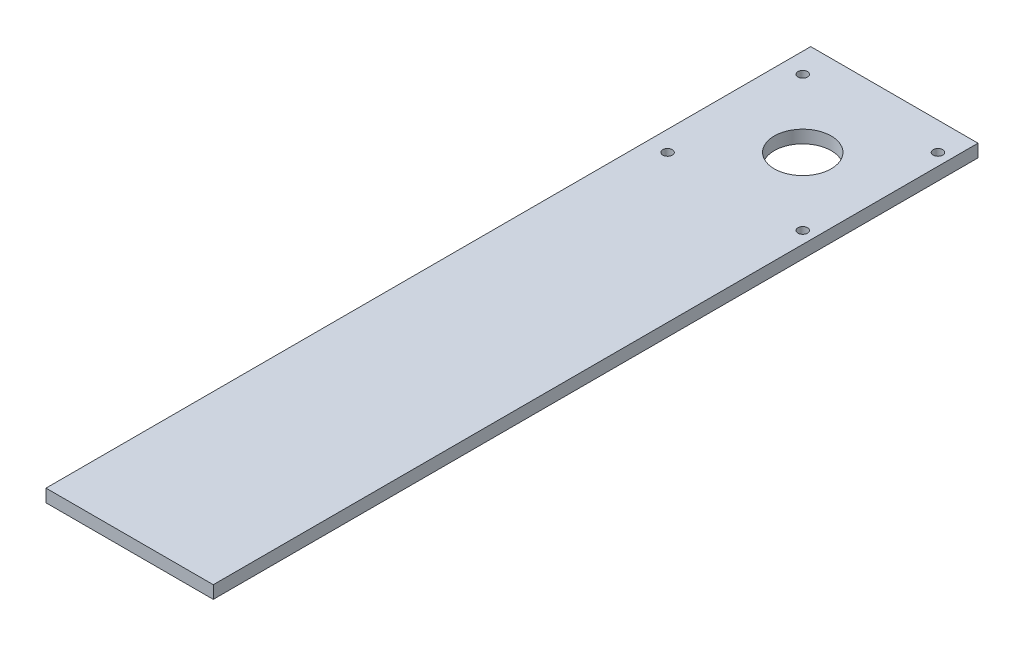
ISO-10303-21;
HEADER;
FILE_DESCRIPTION(('STEP AP214'),'2;1');
FILE_NAME('part.step','',(''),(''),'','','');
FILE_SCHEMA(('AUTOMOTIVE_DESIGN { 1 0 10303 214 1 1 1 1 }'));
ENDSEC;
DATA;
#1=APPLICATION_CONTEXT('core data for automotive mechanical design processes');
#2=APPLICATION_PROTOCOL_DEFINITION('international standard','automotive_design',2000,#1);
#3=PRODUCT_CONTEXT('',#1,'mechanical');
#4=PRODUCT('Part','Part','',(#3));
#5=PRODUCT_RELATED_PRODUCT_CATEGORY('part','',(#4));
#6=PRODUCT_DEFINITION_FORMATION('','',#4);
#7=PRODUCT_DEFINITION_CONTEXT('part definition',#1,'design');
#8=PRODUCT_DEFINITION('design','',#6,#7);
#9=PRODUCT_DEFINITION_SHAPE('','',#8);
#10=(LENGTH_UNIT() NAMED_UNIT(*) SI_UNIT(.MILLI.,.METRE.));
#11=(NAMED_UNIT(*) PLANE_ANGLE_UNIT() SI_UNIT($,.RADIAN.));
#12=(NAMED_UNIT(*) SI_UNIT($,.STERADIAN.) SOLID_ANGLE_UNIT());
#13=UNCERTAINTY_MEASURE_WITH_UNIT(LENGTH_MEASURE(1.E-05),#10,'distance_accuracy_value','');
#14=(GEOMETRIC_REPRESENTATION_CONTEXT(3) GLOBAL_UNCERTAINTY_ASSIGNED_CONTEXT((#13)) GLOBAL_UNIT_ASSIGNED_CONTEXT((#10,
#11,#12)) REPRESENTATION_CONTEXT('',''));
#15=CARTESIAN_POINT('',(0.,0.,0.));
#16=DIRECTION('',(0.,0.,1.));
#17=DIRECTION('',(1.,0.,0.));
#18=AXIS2_PLACEMENT_3D('',#15,#16,#17);
#19=CARTESIAN_POINT('',(0.,8.,0.));
#20=DIRECTION('',(0.,-1.,0.));
#21=DIRECTION('',(0.,0.,-1.));
#22=AXIS2_PLACEMENT_3D('',#19,#20,#21);
#23=PLANE('',#22);
#24=DIRECTION('',(0.,0.,-1.));
#25=VECTOR('',#24,1.);
#26=CARTESIAN_POINT('',(50.,8.,240.));
#27=LINE('',#26,#25);
#28=CARTESIAN_POINT('',(50.,8.,240.));
#29=VERTEX_POINT('',#28);
#30=CARTESIAN_POINT('',(50.,8.,-240.));
#31=VERTEX_POINT('',#30);
#32=EDGE_CURVE('E89',#29,#31,#27,.T.);
#33=ORIENTED_EDGE('',*,*,#32,.T.);
#34=DIRECTION('',(-1.,0.,0.));
#35=VECTOR('',#34,1.);
#36=CARTESIAN_POINT('',(-55.,8.,-240.));
#37=LINE('',#36,#35);
#38=CARTESIAN_POINT('',(-55.,8.,-240.));
#39=VERTEX_POINT('',#38);
#40=EDGE_CURVE('E84',#31,#39,#37,.T.);
#41=ORIENTED_EDGE('',*,*,#40,.T.);
#42=DIRECTION('',(0.,0.,1.));
#43=VECTOR('',#42,1.);
#44=CARTESIAN_POINT('',(-55.,8.,240.));
#45=LINE('',#44,#43);
#46=CARTESIAN_POINT('',(-55.,8.,240.));
#47=VERTEX_POINT('',#46);
#48=EDGE_CURVE('E87',#39,#47,#45,.T.);
#49=ORIENTED_EDGE('',*,*,#48,.T.);
#50=DIRECTION('',(1.,0.,0.));
#51=VECTOR('',#50,1.);
#52=CARTESIAN_POINT('',(-55.,8.,240.));
#53=LINE('',#52,#51);
#54=EDGE_CURVE('E54',#47,#29,#53,.T.);
#55=ORIENTED_EDGE('',*,*,#54,.T.);
#56=EDGE_LOOP('',(#33,#41,#49,#55));
#57=FACE_BOUND('',#56,.T.);
#58=CARTESIAN_POINT('',(0.,8.,-180.));
#59=DIRECTION('',(0.,1.,0.));
#60=DIRECTION('',(0.,0.,1.));
#61=AXIS2_PLACEMENT_3D('',#58,#59,#60);
#62=CIRCLE('',#61,17.8615757887445);
#63=CARTESIAN_POINT('',(0.,8.,-162.138424211255));
#64=VERTEX_POINT('',#63);
#65=EDGE_CURVE('E104',#64,#64,#62,.T.);
#66=ORIENTED_EDGE('',*,*,#65,.F.);
#67=EDGE_LOOP('',(#66));
#68=FACE_BOUND('',#67,.T.);
#69=CARTESIAN_POINT('',(-42.4264068711926,8.,-137.573593128807));
#70=DIRECTION('',(0.,1.,0.));
#71=DIRECTION('',(0.,0.,1.));
#72=AXIS2_PLACEMENT_3D('',#69,#70,#71);
#73=CIRCLE('',#72,3.00000000000004);
#74=CARTESIAN_POINT('',(-42.4264068711926,8.,-134.573593128807));
#75=VERTEX_POINT('',#74);
#76=EDGE_CURVE('E119',#75,#75,#73,.T.);
#77=ORIENTED_EDGE('',*,*,#76,.F.);
#78=EDGE_LOOP('',(#77));
#79=FACE_BOUND('',#78,.T.);
#80=CARTESIAN_POINT('',(-42.4264068711931,8.,-222.426406871193));
#81=DIRECTION('',(0.,1.,0.));
#82=DIRECTION('',(0.,0.,1.));
#83=AXIS2_PLACEMENT_3D('',#80,#81,#82);
#84=CIRCLE('',#83,2.99999999999999);
#85=CARTESIAN_POINT('',(-42.4264068711931,8.,-219.426406871193));
#86=VERTEX_POINT('',#85);
#87=EDGE_CURVE('E125',#86,#86,#84,.T.);
#88=ORIENTED_EDGE('',*,*,#87,.F.);
#89=EDGE_LOOP('',(#88));
#90=FACE_BOUND('',#89,.T.);
#91=CARTESIAN_POINT('',(42.4264068711926,8.,-222.426406871193));
#92=DIRECTION('',(0.,1.,0.));
#93=DIRECTION('',(0.,0.,1.));
#94=AXIS2_PLACEMENT_3D('',#91,#92,#93);
#95=CIRCLE('',#94,3.);
#96=CARTESIAN_POINT('',(42.4264068711926,8.,-219.426406871193));
#97=VERTEX_POINT('',#96);
#98=EDGE_CURVE('E131',#97,#97,#95,.T.);
#99=ORIENTED_EDGE('',*,*,#98,.F.);
#100=EDGE_LOOP('',(#99));
#101=FACE_BOUND('',#100,.T.);
#102=CARTESIAN_POINT('',(42.4264068711931,8.,-137.573593128807));
#103=DIRECTION('',(0.,1.,0.));
#104=DIRECTION('',(0.,0.,1.));
#105=AXIS2_PLACEMENT_3D('',#102,#103,#104);
#106=CIRCLE('',#105,3.00000000000001);
#107=CARTESIAN_POINT('',(42.4264068711931,8.,-134.573593128807));
#108=VERTEX_POINT('',#107);
#109=EDGE_CURVE('E137',#108,#108,#106,.T.);
#110=ORIENTED_EDGE('',*,*,#109,.F.);
#111=EDGE_LOOP('',(#110));
#112=FACE_BOUND('',#111,.T.);
#113=ADVANCED_FACE('F37',(#57,#68,#79,#90,#101,#112),#23,.F.);
#114=CARTESIAN_POINT('',(0.,0.,0.));
#115=DIRECTION('',(0.,-1.,0.));
#116=DIRECTION('',(0.,0.,-1.));
#117=AXIS2_PLACEMENT_3D('',#114,#115,#116);
#118=PLANE('',#117);
#119=CARTESIAN_POINT('',(42.4264068711926,0.,-222.426406871193));
#120=DIRECTION('',(0.,1.,0.));
#121=DIRECTION('',(0.,0.,1.));
#122=AXIS2_PLACEMENT_3D('',#119,#120,#121);
#123=CIRCLE('',#122,3.);
#124=CARTESIAN_POINT('',(42.4264068711926,0.,-219.426406871193));
#125=VERTEX_POINT('',#124);
#126=EDGE_CURVE('E134',#125,#125,#123,.T.);
#127=ORIENTED_EDGE('',*,*,#126,.T.);
#128=EDGE_LOOP('',(#127));
#129=FACE_BOUND('',#128,.T.);
#130=CARTESIAN_POINT('',(-42.4264068711926,0.,-137.573593128807));
#131=DIRECTION('',(0.,1.,0.));
#132=DIRECTION('',(0.,0.,1.));
#133=AXIS2_PLACEMENT_3D('',#130,#131,#132);
#134=CIRCLE('',#133,3.00000000000004);
#135=CARTESIAN_POINT('',(-42.4264068711926,0.,-134.573593128807));
#136=VERTEX_POINT('',#135);
#137=EDGE_CURVE('E122',#136,#136,#134,.T.);
#138=ORIENTED_EDGE('',*,*,#137,.T.);
#139=EDGE_LOOP('',(#138));
#140=FACE_BOUND('',#139,.T.);
#141=DIRECTION('',(0.,0.,-1.));
#142=VECTOR('',#141,1.);
#143=CARTESIAN_POINT('',(50.,0.,240.));
#144=LINE('',#143,#142);
#145=CARTESIAN_POINT('',(50.,0.,240.));
#146=VERTEX_POINT('',#145);
#147=CARTESIAN_POINT('',(50.,0.,-240.));
#148=VERTEX_POINT('',#147);
#149=EDGE_CURVE('E101',#146,#148,#144,.T.);
#150=ORIENTED_EDGE('',*,*,#149,.F.);
#151=DIRECTION('',(1.,0.,0.));
#152=VECTOR('',#151,1.);
#153=CARTESIAN_POINT('',(-55.,0.,240.));
#154=LINE('',#153,#152);
#155=CARTESIAN_POINT('',(-55.,0.,240.));
#156=VERTEX_POINT('',#155);
#157=EDGE_CURVE('E77',#156,#146,#154,.T.);
#158=ORIENTED_EDGE('',*,*,#157,.F.);
#159=DIRECTION('',(0.,0.,1.));
#160=VECTOR('',#159,1.);
#161=CARTESIAN_POINT('',(-55.,0.,240.));
#162=LINE('',#161,#160);
#163=CARTESIAN_POINT('',(-55.,0.,-240.));
#164=VERTEX_POINT('',#163);
#165=EDGE_CURVE('E71',#164,#156,#162,.T.);
#166=ORIENTED_EDGE('',*,*,#165,.F.);
#167=DIRECTION('',(-1.,0.,0.));
#168=VECTOR('',#167,1.);
#169=CARTESIAN_POINT('',(-55.,0.,-240.));
#170=LINE('',#169,#168);
#171=EDGE_CURVE('E93',#148,#164,#170,.T.);
#172=ORIENTED_EDGE('',*,*,#171,.F.);
#173=EDGE_LOOP('',(#150,#158,#166,#172));
#174=FACE_BOUND('',#173,.T.);
#175=CARTESIAN_POINT('',(0.,0.,-180.));
#176=DIRECTION('',(0.,1.,0.));
#177=DIRECTION('',(0.,0.,1.));
#178=AXIS2_PLACEMENT_3D('',#175,#176,#177);
#179=CIRCLE('',#178,17.8615757887445);
#180=CARTESIAN_POINT('',(0.,0.,-162.138424211255));
#181=VERTEX_POINT('',#180);
#182=EDGE_CURVE('E116',#181,#181,#179,.T.);
#183=ORIENTED_EDGE('',*,*,#182,.T.);
#184=EDGE_LOOP('',(#183));
#185=FACE_BOUND('',#184,.T.);
#186=CARTESIAN_POINT('',(-42.4264068711931,0.,-222.426406871193));
#187=DIRECTION('',(0.,1.,0.));
#188=DIRECTION('',(0.,0.,1.));
#189=AXIS2_PLACEMENT_3D('',#186,#187,#188);
#190=CIRCLE('',#189,2.99999999999999);
#191=CARTESIAN_POINT('',(-42.4264068711931,0.,-219.426406871193));
#192=VERTEX_POINT('',#191);
#193=EDGE_CURVE('E128',#192,#192,#190,.T.);
#194=ORIENTED_EDGE('',*,*,#193,.T.);
#195=EDGE_LOOP('',(#194));
#196=FACE_BOUND('',#195,.T.);
#197=CARTESIAN_POINT('',(42.4264068711931,0.,-137.573593128807));
#198=DIRECTION('',(0.,1.,0.));
#199=DIRECTION('',(0.,0.,1.));
#200=AXIS2_PLACEMENT_3D('',#197,#198,#199);
#201=CIRCLE('',#200,3.00000000000001);
#202=CARTESIAN_POINT('',(42.4264068711931,0.,-134.573593128807));
#203=VERTEX_POINT('',#202);
#204=EDGE_CURVE('E140',#203,#203,#201,.T.);
#205=ORIENTED_EDGE('',*,*,#204,.T.);
#206=EDGE_LOOP('',(#205));
#207=FACE_BOUND('',#206,.T.);
#208=ADVANCED_FACE('F112',(#129,#140,#174,#185,#196,#207),#118,.T.);
#209=CARTESIAN_POINT('',(50.,8.,240.));
#210=DIRECTION('',(-1.,0.,0.));
#211=DIRECTION('',(0.,0.,1.));
#212=AXIS2_PLACEMENT_3D('',#209,#210,#211);
#213=PLANE('',#212);
#214=ORIENTED_EDGE('',*,*,#149,.T.);
#215=DIRECTION('',(0.,-1.,0.));
#216=VECTOR('',#215,1.);
#217=CARTESIAN_POINT('',(50.,8.,-240.));
#218=LINE('',#217,#216);
#219=EDGE_CURVE('E11',#31,#148,#218,.T.);
#220=ORIENTED_EDGE('',*,*,#219,.F.);
#221=ORIENTED_EDGE('',*,*,#32,.F.);
#222=DIRECTION('',(0.,-1.,0.));
#223=VECTOR('',#222,1.);
#224=CARTESIAN_POINT('',(50.,8.,240.));
#225=LINE('',#224,#223);
#226=EDGE_CURVE('E97',#29,#146,#225,.T.);
#227=ORIENTED_EDGE('',*,*,#226,.T.);
#228=EDGE_LOOP('',(#214,#220,#221,#227));
#229=FACE_BOUND('',#228,.T.);
#230=ADVANCED_FACE('F39',(#229),#213,.F.);
#231=CARTESIAN_POINT('',(-55.,8.,-240.));
#232=DIRECTION('',(0.,0.,1.));
#233=DIRECTION('',(1.,0.,0.));
#234=AXIS2_PLACEMENT_3D('',#231,#232,#233);
#235=PLANE('',#234);
#236=ORIENTED_EDGE('',*,*,#171,.T.);
#237=DIRECTION('',(0.,-1.,0.));
#238=VECTOR('',#237,1.);
#239=CARTESIAN_POINT('',(-55.,8.,-240.));
#240=LINE('',#239,#238);
#241=EDGE_CURVE('E46',#39,#164,#240,.T.);
#242=ORIENTED_EDGE('',*,*,#241,.F.);
#243=ORIENTED_EDGE('',*,*,#40,.F.);
#244=ORIENTED_EDGE('',*,*,#219,.T.);
#245=EDGE_LOOP('',(#236,#242,#243,#244));
#246=FACE_BOUND('',#245,.T.);
#247=ADVANCED_FACE('F92',(#246),#235,.F.);
#248=CARTESIAN_POINT('',(-55.,8.,240.));
#249=DIRECTION('',(1.,0.,0.));
#250=DIRECTION('',(0.,0.,-1.));
#251=AXIS2_PLACEMENT_3D('',#248,#249,#250);
#252=PLANE('',#251);
#253=ORIENTED_EDGE('',*,*,#165,.T.);
#254=DIRECTION('',(0.,-1.,0.));
#255=VECTOR('',#254,1.);
#256=CARTESIAN_POINT('',(-55.,8.,240.));
#257=LINE('',#256,#255);
#258=EDGE_CURVE('E94',#47,#156,#257,.T.);
#259=ORIENTED_EDGE('',*,*,#258,.F.);
#260=ORIENTED_EDGE('',*,*,#48,.F.);
#261=ORIENTED_EDGE('',*,*,#241,.T.);
#262=EDGE_LOOP('',(#253,#259,#260,#261));
#263=FACE_BOUND('',#262,.T.);
#264=ADVANCED_FACE('F95',(#263),#252,.F.);
#265=CARTESIAN_POINT('',(-55.,8.,240.));
#266=DIRECTION('',(0.,0.,-1.));
#267=DIRECTION('',(-1.,0.,0.));
#268=AXIS2_PLACEMENT_3D('',#265,#266,#267);
#269=PLANE('',#268);
#270=ORIENTED_EDGE('',*,*,#157,.T.);
#271=ORIENTED_EDGE('',*,*,#226,.F.);
#272=ORIENTED_EDGE('',*,*,#54,.F.);
#273=ORIENTED_EDGE('',*,*,#258,.T.);
#274=EDGE_LOOP('',(#270,#271,#272,#273));
#275=FACE_BOUND('',#274,.T.);
#276=ADVANCED_FACE('F109',(#275),#269,.F.);
#277=CARTESIAN_POINT('',(0.,8.,-180.));
#278=DIRECTION('',(0.,-1.,0.));
#279=DIRECTION('',(0.,0.,-1.));
#280=AXIS2_PLACEMENT_3D('',#277,#278,#279);
#281=CYLINDRICAL_SURFACE('',#280,17.8615757887445);
#282=ORIENTED_EDGE('',*,*,#65,.T.);
#283=EDGE_LOOP('',(#282));
#284=FACE_BOUND('',#283,.T.);
#285=ORIENTED_EDGE('',*,*,#182,.F.);
#286=EDGE_LOOP('',(#285));
#287=FACE_BOUND('',#286,.T.);
#288=ADVANCED_FACE('F157',(#284,#287),#281,.F.);
#289=CARTESIAN_POINT('',(-42.4264068711926,8.,-137.573593128807));
#290=DIRECTION('',(0.,-1.,0.));
#291=DIRECTION('',(0.,0.,-1.));
#292=AXIS2_PLACEMENT_3D('',#289,#290,#291);
#293=CYLINDRICAL_SURFACE('',#292,3.00000000000004);
#294=ORIENTED_EDGE('',*,*,#76,.T.);
#295=EDGE_LOOP('',(#294));
#296=FACE_BOUND('',#295,.T.);
#297=ORIENTED_EDGE('',*,*,#137,.F.);
#298=EDGE_LOOP('',(#297));
#299=FACE_BOUND('',#298,.T.);
#300=ADVANCED_FACE('F211',(#296,#299),#293,.F.);
#301=CARTESIAN_POINT('',(-42.4264068711931,8.,-222.426406871193));
#302=DIRECTION('',(0.,-1.,0.));
#303=DIRECTION('',(0.,0.,-1.));
#304=AXIS2_PLACEMENT_3D('',#301,#302,#303);
#305=CYLINDRICAL_SURFACE('',#304,2.99999999999999);
#306=ORIENTED_EDGE('',*,*,#87,.T.);
#307=EDGE_LOOP('',(#306));
#308=FACE_BOUND('',#307,.T.);
#309=ORIENTED_EDGE('',*,*,#193,.F.);
#310=EDGE_LOOP('',(#309));
#311=FACE_BOUND('',#310,.T.);
#312=ADVANCED_FACE('F220',(#308,#311),#305,.F.);
#313=CARTESIAN_POINT('',(42.4264068711926,8.,-222.426406871193));
#314=DIRECTION('',(0.,-1.,0.));
#315=DIRECTION('',(0.,0.,-1.));
#316=AXIS2_PLACEMENT_3D('',#313,#314,#315);
#317=CYLINDRICAL_SURFACE('',#316,3.);
#318=ORIENTED_EDGE('',*,*,#98,.T.);
#319=EDGE_LOOP('',(#318));
#320=FACE_BOUND('',#319,.T.);
#321=ORIENTED_EDGE('',*,*,#126,.F.);
#322=EDGE_LOOP('',(#321));
#323=FACE_BOUND('',#322,.T.);
#324=ADVANCED_FACE('F229',(#320,#323),#317,.F.);
#325=CARTESIAN_POINT('',(42.4264068711931,8.,-137.573593128807));
#326=DIRECTION('',(0.,-1.,0.));
#327=DIRECTION('',(0.,0.,-1.));
#328=AXIS2_PLACEMENT_3D('',#325,#326,#327);
#329=CYLINDRICAL_SURFACE('',#328,3.00000000000001);
#330=ORIENTED_EDGE('',*,*,#109,.T.);
#331=EDGE_LOOP('',(#330));
#332=FACE_BOUND('',#331,.T.);
#333=ORIENTED_EDGE('',*,*,#204,.F.);
#334=EDGE_LOOP('',(#333));
#335=FACE_BOUND('',#334,.T.);
#336=ADVANCED_FACE('F146',(#332,#335),#329,.F.);
#337=CLOSED_SHELL('',(#113,#208,#230,#247,#264,#276,#288,#300,#312,#324,#336));
#338=MANIFOLD_SOLID_BREP('B2',#337);
#339=ADVANCED_BREP_SHAPE_REPRESENTATION('',(#18,#338),#14);
#340=SHAPE_DEFINITION_REPRESENTATION(#9,#339);
ENDSEC;
END-ISO-10303-21;
